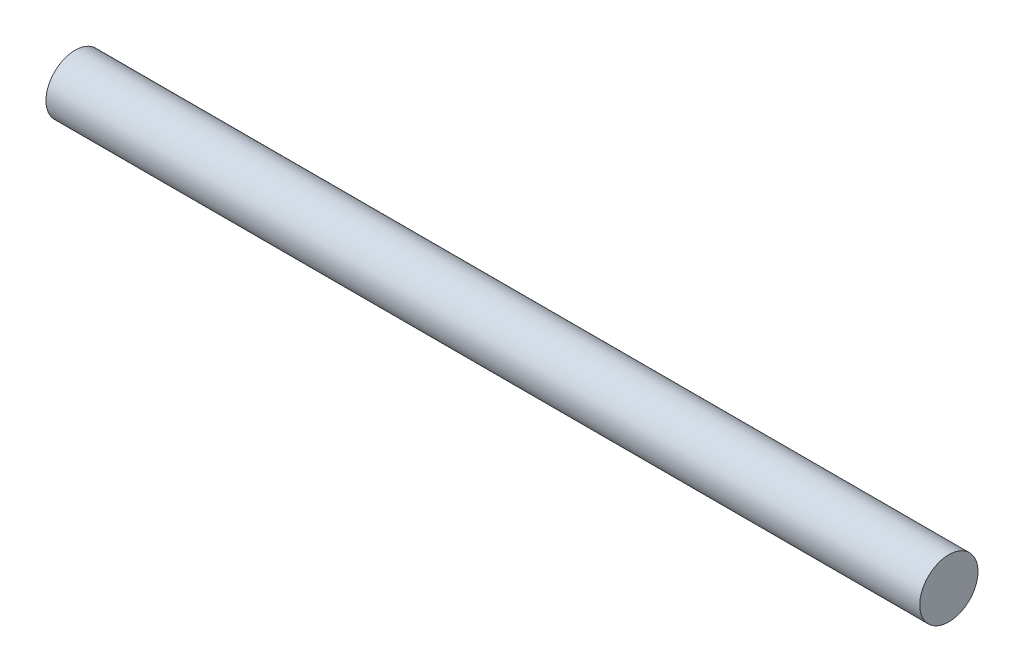
ISO-10303-21;
HEADER;
FILE_DESCRIPTION(('STEP AP214'),'2;1');
FILE_NAME('part.step','',(''),(''),'','','');
FILE_SCHEMA(('AUTOMOTIVE_DESIGN { 1 0 10303 214 1 1 1 1 }'));
ENDSEC;
DATA;
#1=APPLICATION_CONTEXT('core data for automotive mechanical design processes');
#2=APPLICATION_PROTOCOL_DEFINITION('international standard','automotive_design',2000,#1);
#3=PRODUCT_CONTEXT('',#1,'mechanical');
#4=PRODUCT('Part','Part','',(#3));
#5=PRODUCT_RELATED_PRODUCT_CATEGORY('part','',(#4));
#6=PRODUCT_DEFINITION_FORMATION('','',#4);
#7=PRODUCT_DEFINITION_CONTEXT('part definition',#1,'design');
#8=PRODUCT_DEFINITION('design','',#6,#7);
#9=PRODUCT_DEFINITION_SHAPE('','',#8);
#10=(LENGTH_UNIT() NAMED_UNIT(*) SI_UNIT(.MILLI.,.METRE.));
#11=(NAMED_UNIT(*) PLANE_ANGLE_UNIT() SI_UNIT($,.RADIAN.));
#12=(NAMED_UNIT(*) SI_UNIT($,.STERADIAN.) SOLID_ANGLE_UNIT());
#13=UNCERTAINTY_MEASURE_WITH_UNIT(LENGTH_MEASURE(1.E-05),#10,'distance_accuracy_value','');
#14=(GEOMETRIC_REPRESENTATION_CONTEXT(3) GLOBAL_UNCERTAINTY_ASSIGNED_CONTEXT((#13)) GLOBAL_UNIT_ASSIGNED_CONTEXT((#10,
#11,#12)) REPRESENTATION_CONTEXT('',''));
#15=CARTESIAN_POINT('',(0.,0.,0.));
#16=DIRECTION('',(0.,0.,1.));
#17=DIRECTION('',(1.,0.,0.));
#18=AXIS2_PLACEMENT_3D('',#15,#16,#17);
#19=CARTESIAN_POINT('',(-75.,0.,0.));
#20=DIRECTION('',(1.,0.,0.));
#21=DIRECTION('',(0.,0.,-1.));
#22=AXIS2_PLACEMENT_3D('',#19,#20,#21);
#23=CYLINDRICAL_SURFACE('',#22,5.);
#24=CARTESIAN_POINT('',(-75.,0.,0.));
#25=DIRECTION('',(1.,0.,0.));
#26=DIRECTION('',(0.,0.,-1.));
#27=AXIS2_PLACEMENT_3D('',#24,#25,#26);
#28=CIRCLE('',#27,5.);
#29=CARTESIAN_POINT('',(-75.,0.,-5.));
#30=VERTEX_POINT('',#29);
#31=EDGE_CURVE('E10',#30,#30,#28,.T.);
#32=ORIENTED_EDGE('',*,*,#31,.T.);
#33=EDGE_LOOP('',(#32));
#34=FACE_BOUND('',#33,.T.);
#35=CARTESIAN_POINT('',(75.,0.,0.));
#36=DIRECTION('',(1.,0.,0.));
#37=DIRECTION('',(0.,0.,-1.));
#38=AXIS2_PLACEMENT_3D('',#35,#36,#37);
#39=CIRCLE('',#38,5.);
#40=CARTESIAN_POINT('',(75.,0.,-5.));
#41=VERTEX_POINT('',#40);
#42=EDGE_CURVE('E43',#41,#41,#39,.T.);
#43=ORIENTED_EDGE('',*,*,#42,.F.);
#44=EDGE_LOOP('',(#43));
#45=FACE_BOUND('',#44,.T.);
#46=ADVANCED_FACE('F37',(#34,#45),#23,.T.);
#47=CARTESIAN_POINT('',(-75.,0.,0.));
#48=DIRECTION('',(1.,0.,0.));
#49=DIRECTION('',(0.,0.,-1.));
#50=AXIS2_PLACEMENT_3D('',#47,#48,#49);
#51=PLANE('',#50);
#52=ORIENTED_EDGE('',*,*,#31,.F.);
#53=EDGE_LOOP('',(#52));
#54=FACE_BOUND('',#53,.T.);
#55=ADVANCED_FACE('F52',(#54),#51,.F.);
#56=CARTESIAN_POINT('',(75.,0.,0.));
#57=DIRECTION('',(1.,0.,0.));
#58=DIRECTION('',(0.,0.,-1.));
#59=AXIS2_PLACEMENT_3D('',#56,#57,#58);
#60=PLANE('',#59);
#61=ORIENTED_EDGE('',*,*,#42,.T.);
#62=EDGE_LOOP('',(#61));
#63=FACE_BOUND('',#62,.T.);
#64=ADVANCED_FACE('F49',(#63),#60,.T.);
#65=CLOSED_SHELL('',(#46,#55,#64));
#66=MANIFOLD_SOLID_BREP('B2',#65);
#67=ADVANCED_BREP_SHAPE_REPRESENTATION('',(#18,#66),#14);
#68=SHAPE_DEFINITION_REPRESENTATION(#9,#67);
ENDSEC;
END-ISO-10303-21;
